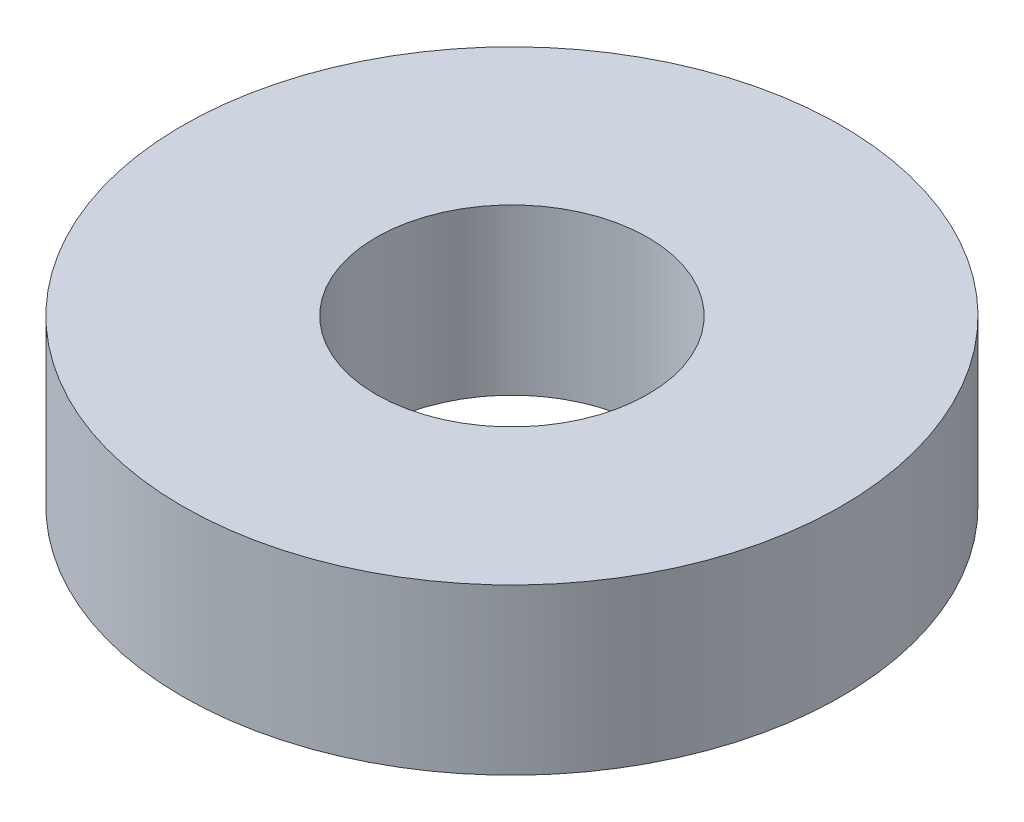
ISO-10303-21;
HEADER;
FILE_DESCRIPTION(('STEP AP214'),'2;1');
FILE_NAME('part.step','',(''),(''),'','','');
FILE_SCHEMA(('AUTOMOTIVE_DESIGN { 1 0 10303 214 1 1 1 1 }'));
ENDSEC;
DATA;
#1=APPLICATION_CONTEXT('core data for automotive mechanical design processes');
#2=APPLICATION_PROTOCOL_DEFINITION('international standard','automotive_design',2000,#1);
#3=PRODUCT_CONTEXT('',#1,'mechanical');
#4=PRODUCT('Part','Part','',(#3));
#5=PRODUCT_RELATED_PRODUCT_CATEGORY('part','',(#4));
#6=PRODUCT_DEFINITION_FORMATION('','',#4);
#7=PRODUCT_DEFINITION_CONTEXT('part definition',#1,'design');
#8=PRODUCT_DEFINITION('design','',#6,#7);
#9=PRODUCT_DEFINITION_SHAPE('','',#8);
#10=(LENGTH_UNIT() NAMED_UNIT(*) SI_UNIT(.MILLI.,.METRE.));
#11=(NAMED_UNIT(*) PLANE_ANGLE_UNIT() SI_UNIT($,.RADIAN.));
#12=(NAMED_UNIT(*) SI_UNIT($,.STERADIAN.) SOLID_ANGLE_UNIT());
#13=UNCERTAINTY_MEASURE_WITH_UNIT(LENGTH_MEASURE(1.E-05),#10,'distance_accuracy_value','');
#14=(GEOMETRIC_REPRESENTATION_CONTEXT(3) GLOBAL_UNCERTAINTY_ASSIGNED_CONTEXT((#13)) GLOBAL_UNIT_ASSIGNED_CONTEXT((#10,
#11,#12)) REPRESENTATION_CONTEXT('',''));
#15=CARTESIAN_POINT('',(0.,0.,0.));
#16=DIRECTION('',(0.,0.,1.));
#17=DIRECTION('',(1.,0.,0.));
#18=AXIS2_PLACEMENT_3D('',#15,#16,#17);
#19=CARTESIAN_POINT('',(0.,2.,0.));
#20=DIRECTION('',(0.,1.,0.));
#21=DIRECTION('',(0.,0.,1.));
#22=AXIS2_PLACEMENT_3D('',#19,#20,#21);
#23=PLANE('',#22);
#24=CARTESIAN_POINT('',(0.,2.,0.));
#25=DIRECTION('',(0.,1.,0.));
#26=DIRECTION('',(0.,0.,1.));
#27=AXIS2_PLACEMENT_3D('',#24,#25,#26);
#28=CIRCLE('',#27,4.);
#29=CARTESIAN_POINT('',(0.,2.,4.));
#30=VERTEX_POINT('',#29);
#31=EDGE_CURVE('E10',#30,#30,#28,.T.);
#32=ORIENTED_EDGE('',*,*,#31,.T.);
#33=EDGE_LOOP('',(#32));
#34=FACE_BOUND('',#33,.T.);
#35=CARTESIAN_POINT('',(0.,2.,0.));
#36=DIRECTION('',(0.,1.,0.));
#37=DIRECTION('',(0.,0.,1.));
#38=AXIS2_PLACEMENT_3D('',#35,#36,#37);
#39=CIRCLE('',#38,1.65);
#40=CARTESIAN_POINT('',(0.,2.,1.65));
#41=VERTEX_POINT('',#40);
#42=EDGE_CURVE('E48',#41,#41,#39,.T.);
#43=ORIENTED_EDGE('',*,*,#42,.F.);
#44=EDGE_LOOP('',(#43));
#45=FACE_BOUND('',#44,.T.);
#46=ADVANCED_FACE('F37',(#34,#45),#23,.T.);
#47=CARTESIAN_POINT('',(0.,0.,0.));
#48=DIRECTION('',(0.,1.,0.));
#49=DIRECTION('',(0.,0.,1.));
#50=AXIS2_PLACEMENT_3D('',#47,#48,#49);
#51=PLANE('',#50);
#52=CARTESIAN_POINT('',(0.,0.,0.));
#53=DIRECTION('',(0.,1.,0.));
#54=DIRECTION('',(0.,0.,1.));
#55=AXIS2_PLACEMENT_3D('',#52,#53,#54);
#56=CIRCLE('',#55,4.);
#57=CARTESIAN_POINT('',(0.,0.,4.));
#58=VERTEX_POINT('',#57);
#59=EDGE_CURVE('E41',#58,#58,#56,.T.);
#60=ORIENTED_EDGE('',*,*,#59,.F.);
#61=EDGE_LOOP('',(#60));
#62=FACE_BOUND('',#61,.T.);
#63=CARTESIAN_POINT('',(0.,0.,0.));
#64=DIRECTION('',(0.,1.,0.));
#65=DIRECTION('',(0.,0.,1.));
#66=AXIS2_PLACEMENT_3D('',#63,#64,#65);
#67=CIRCLE('',#66,1.65);
#68=CARTESIAN_POINT('',(0.,0.,1.65));
#69=VERTEX_POINT('',#68);
#70=EDGE_CURVE('E50',#69,#69,#67,.T.);
#71=ORIENTED_EDGE('',*,*,#70,.T.);
#72=EDGE_LOOP('',(#71));
#73=FACE_BOUND('',#72,.T.);
#74=ADVANCED_FACE('F60',(#62,#73),#51,.F.);
#75=CARTESIAN_POINT('',(0.,2.,0.));
#76=DIRECTION('',(0.,-1.,0.));
#77=DIRECTION('',(0.,0.,-1.));
#78=AXIS2_PLACEMENT_3D('',#75,#76,#77);
#79=CYLINDRICAL_SURFACE('',#78,4.);
#80=ORIENTED_EDGE('',*,*,#31,.F.);
#81=EDGE_LOOP('',(#80));
#82=FACE_BOUND('',#81,.T.);
#83=ORIENTED_EDGE('',*,*,#59,.T.);
#84=EDGE_LOOP('',(#83));
#85=FACE_BOUND('',#84,.T.);
#86=ADVANCED_FACE('F39',(#82,#85),#79,.T.);
#87=CARTESIAN_POINT('',(0.,2.,0.));
#88=DIRECTION('',(0.,-1.,0.));
#89=DIRECTION('',(0.,0.,-1.));
#90=AXIS2_PLACEMENT_3D('',#87,#88,#89);
#91=CYLINDRICAL_SURFACE('',#90,1.65);
#92=ORIENTED_EDGE('',*,*,#42,.T.);
#93=EDGE_LOOP('',(#92));
#94=FACE_BOUND('',#93,.T.);
#95=ORIENTED_EDGE('',*,*,#70,.F.);
#96=EDGE_LOOP('',(#95));
#97=FACE_BOUND('',#96,.T.);
#98=ADVANCED_FACE('F56',(#94,#97),#91,.F.);
#99=CLOSED_SHELL('',(#46,#74,#86,#98));
#100=MANIFOLD_SOLID_BREP('B2',#99);
#101=ADVANCED_BREP_SHAPE_REPRESENTATION('',(#18,#100),#14);
#102=SHAPE_DEFINITION_REPRESENTATION(#9,#101);
ENDSEC;
END-ISO-10303-21;
